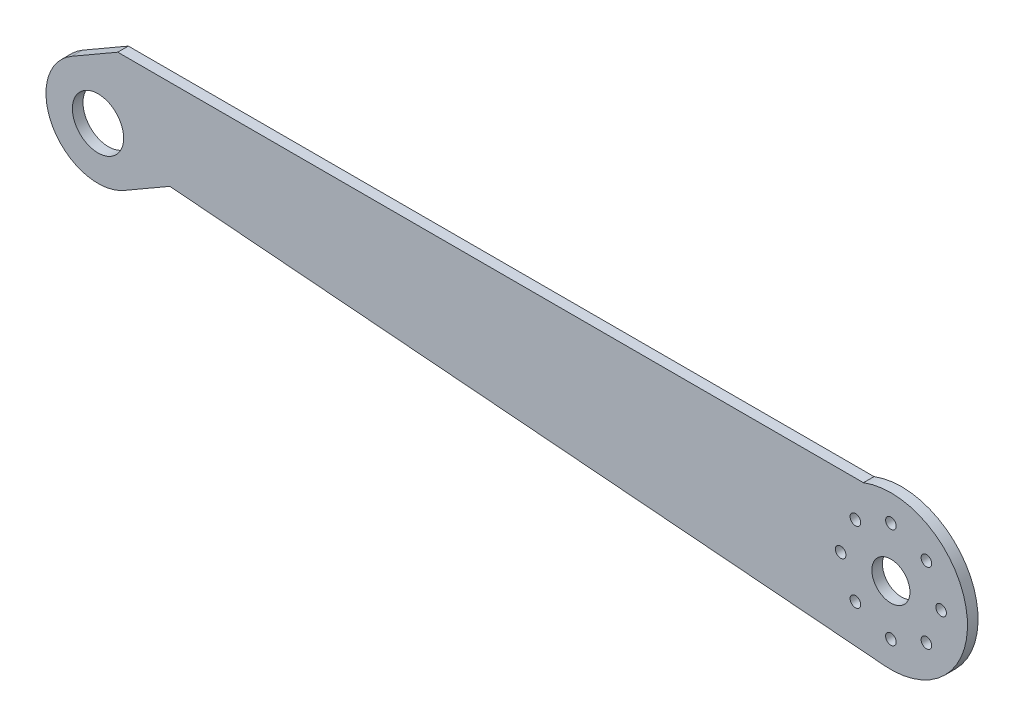
ISO-10303-21;
HEADER;
FILE_DESCRIPTION(('STEP AP214'),'2;1');
FILE_NAME('part.step','',(''),(''),'','','');
FILE_SCHEMA(('AUTOMOTIVE_DESIGN { 1 0 10303 214 1 1 1 1 }'));
ENDSEC;
DATA;
#1=APPLICATION_CONTEXT('core data for automotive mechanical design processes');
#2=APPLICATION_PROTOCOL_DEFINITION('international standard','automotive_design',2000,#1);
#3=PRODUCT_CONTEXT('',#1,'mechanical');
#4=PRODUCT('Part','Part','',(#3));
#5=PRODUCT_RELATED_PRODUCT_CATEGORY('part','',(#4));
#6=PRODUCT_DEFINITION_FORMATION('','',#4);
#7=PRODUCT_DEFINITION_CONTEXT('part definition',#1,'design');
#8=PRODUCT_DEFINITION('design','',#6,#7);
#9=PRODUCT_DEFINITION_SHAPE('','',#8);
#10=(LENGTH_UNIT() NAMED_UNIT(*) SI_UNIT(.MILLI.,.METRE.));
#11=(NAMED_UNIT(*) PLANE_ANGLE_UNIT() SI_UNIT($,.RADIAN.));
#12=(NAMED_UNIT(*) SI_UNIT($,.STERADIAN.) SOLID_ANGLE_UNIT());
#13=UNCERTAINTY_MEASURE_WITH_UNIT(LENGTH_MEASURE(1.E-05),#10,'distance_accuracy_value','');
#14=(GEOMETRIC_REPRESENTATION_CONTEXT(3) GLOBAL_UNCERTAINTY_ASSIGNED_CONTEXT((#13)) GLOBAL_UNIT_ASSIGNED_CONTEXT((#10,
#11,#12)) REPRESENTATION_CONTEXT('',''));
#15=CARTESIAN_POINT('',(0.,0.,0.));
#16=DIRECTION('',(0.,0.,1.));
#17=DIRECTION('',(1.,0.,0.));
#18=AXIS2_PLACEMENT_3D('',#15,#16,#17);
#19=CARTESIAN_POINT('',(0.,0.,4.));
#20=DIRECTION('',(0.,0.,-1.));
#21=DIRECTION('',(-1.,0.,0.));
#22=AXIS2_PLACEMENT_3D('',#19,#20,#21);
#23=PLANE('',#22);
#24=CARTESIAN_POINT('',(0.,0.,4.));
#25=DIRECTION('',(0.,0.,1.));
#26=DIRECTION('',(-1.,0.,0.));
#27=AXIS2_PLACEMENT_3D('',#24,#25,#26);
#28=CIRCLE('',#27,19.7);
#29=CARTESIAN_POINT('',(-9.85000000000009,17.0607004545534,4.));
#30=VERTEX_POINT('',#29);
#31=CARTESIAN_POINT('',(9.85000000000009,-17.0607004545534,4.));
#32=VERTEX_POINT('',#31);
#33=EDGE_CURVE('E132',#30,#32,#28,.T.);
#34=ORIENTED_EDGE('',*,*,#33,.T.);
#35=DIRECTION('',(0.866025403784436,0.500000000000004,0.));
#36=VECTOR('',#35,1.);
#37=CARTESIAN_POINT('',(9.85000000000009,-17.0607004545534,4.));
#38=LINE('',#37,#36);
#39=CARTESIAN_POINT('',(27.1705080756888,-7.06070045455331,4.));
#40=VERTEX_POINT('',#39);
#41=EDGE_CURVE('E90',#32,#40,#38,.T.);
#42=ORIENTED_EDGE('',*,*,#41,.T.);
#43=DIRECTION('',(0.996754774778399,-0.0804979438027058,0.));
#44=VECTOR('',#43,1.);
#45=CARTESIAN_POINT('',(27.1705080756888,-7.06070045455331,4.));
#46=LINE('',#45,#44);
#47=CARTESIAN_POINT('',(297.665559629722,-28.9058884685736,4.));
#48=VERTEX_POINT('',#47);
#49=EDGE_CURVE('E103',#40,#48,#46,.T.);
#50=ORIENTED_EDGE('',*,*,#49,.T.);
#51=CARTESIAN_POINT('',(299.999218229697,-0.00968016381513675,4.));
#52=DIRECTION('',(0.,0.,1.));
#53=DIRECTION('',(-1.,0.,0.));
#54=AXIS2_PLACEMENT_3D('',#51,#52,#53);
#55=CIRCLE('',#54,28.9902883195947);
#56=CARTESIAN_POINT('',(289.624667153632,27.0607004545535,4.));
#57=VERTEX_POINT('',#56);
#58=EDGE_CURVE('E97',#48,#57,#55,.T.);
#59=ORIENTED_EDGE('',*,*,#58,.T.);
#60=DIRECTION('',(-1.,0.,0.));
#61=VECTOR('',#60,1.);
#62=CARTESIAN_POINT('',(289.624667153632,27.0607004545535,4.));
#63=LINE('',#62,#61);
#64=CARTESIAN_POINT('',(7.47050807568864,27.0607004545535,4.));
#65=VERTEX_POINT('',#64);
#66=EDGE_CURVE('E101',#57,#65,#63,.T.);
#67=ORIENTED_EDGE('',*,*,#66,.T.);
#68=DIRECTION('',(-0.866025403784436,-0.500000000000004,0.));
#69=VECTOR('',#68,1.);
#70=CARTESIAN_POINT('',(-9.85000000000009,17.0607004545534,4.));
#71=LINE('',#70,#69);
#72=EDGE_CURVE('E53',#65,#30,#71,.T.);
#73=ORIENTED_EDGE('',*,*,#72,.T.);
#74=EDGE_LOOP('',(#34,#42,#50,#59,#67,#73));
#75=FACE_BOUND('',#74,.T.);
#76=CARTESIAN_POINT('',(0.,0.,4.));
#77=DIRECTION('',(0.,0.,1.));
#78=DIRECTION('',(1.,0.,0.));
#79=AXIS2_PLACEMENT_3D('',#76,#77,#78);
#80=CIRCLE('',#79,9.7);
#81=CARTESIAN_POINT('',(9.7,0.,4.));
#82=VERTEX_POINT('',#81);
#83=EDGE_CURVE('E125',#82,#82,#80,.T.);
#84=ORIENTED_EDGE('',*,*,#83,.F.);
#85=EDGE_LOOP('',(#84));
#86=FACE_BOUND('',#85,.T.);
#87=CARTESIAN_POINT('',(300.,0.,4.));
#88=DIRECTION('',(0.,0.,1.));
#89=DIRECTION('',(1.,0.,0.));
#90=AXIS2_PLACEMENT_3D('',#87,#88,#89);
#91=CIRCLE('',#90,7.19999999999997);
#92=CARTESIAN_POINT('',(307.2,0.,4.));
#93=VERTEX_POINT('',#92);
#94=EDGE_CURVE('E256',#93,#93,#91,.T.);
#95=ORIENTED_EDGE('',*,*,#94,.F.);
#96=EDGE_LOOP('',(#95));
#97=FACE_BOUND('',#96,.T.);
#98=CARTESIAN_POINT('',(319.,0.,4.));
#99=DIRECTION('',(0.,0.,1.));
#100=DIRECTION('',(1.,0.,0.));
#101=AXIS2_PLACEMENT_3D('',#98,#99,#100);
#102=CIRCLE('',#101,2.);
#103=CARTESIAN_POINT('',(321.,0.,4.));
#104=VERTEX_POINT('',#103);
#105=EDGE_CURVE('E250',#104,#104,#102,.T.);
#106=ORIENTED_EDGE('',*,*,#105,.F.);
#107=EDGE_LOOP('',(#106));
#108=FACE_BOUND('',#107,.T.);
#109=CARTESIAN_POINT('',(313.435028842544,-13.4350288425444,4.));
#110=DIRECTION('',(0.,0.,1.));
#111=DIRECTION('',(1.,0.,0.));
#112=AXIS2_PLACEMENT_3D('',#109,#110,#111);
#113=CIRCLE('',#112,1.99999999999999);
#114=CARTESIAN_POINT('',(315.435028842544,-13.4350288425444,4.));
#115=VERTEX_POINT('',#114);
#116=EDGE_CURVE('E244',#115,#115,#113,.T.);
#117=ORIENTED_EDGE('',*,*,#116,.F.);
#118=EDGE_LOOP('',(#117));
#119=FACE_BOUND('',#118,.T.);
#120=CARTESIAN_POINT('',(300.,-19.,4.));
#121=DIRECTION('',(0.,0.,1.));
#122=DIRECTION('',(1.,0.,0.));
#123=AXIS2_PLACEMENT_3D('',#120,#121,#122);
#124=CIRCLE('',#123,2.);
#125=CARTESIAN_POINT('',(302.,-19.,4.));
#126=VERTEX_POINT('',#125);
#127=EDGE_CURVE('E238',#126,#126,#124,.T.);
#128=ORIENTED_EDGE('',*,*,#127,.F.);
#129=EDGE_LOOP('',(#128));
#130=FACE_BOUND('',#129,.T.);
#131=CARTESIAN_POINT('',(286.564971157456,-13.4350288425444,4.));
#132=DIRECTION('',(0.,0.,1.));
#133=DIRECTION('',(1.,0.,0.));
#134=AXIS2_PLACEMENT_3D('',#131,#132,#133);
#135=CIRCLE('',#134,2.);
#136=CARTESIAN_POINT('',(288.564971157456,-13.4350288425444,4.));
#137=VERTEX_POINT('',#136);
#138=EDGE_CURVE('E232',#137,#137,#135,.T.);
#139=ORIENTED_EDGE('',*,*,#138,.F.);
#140=EDGE_LOOP('',(#139));
#141=FACE_BOUND('',#140,.T.);
#142=CARTESIAN_POINT('',(281.,0.,4.));
#143=DIRECTION('',(0.,0.,1.));
#144=DIRECTION('',(1.,0.,0.));
#145=AXIS2_PLACEMENT_3D('',#142,#143,#144);
#146=CIRCLE('',#145,2.);
#147=CARTESIAN_POINT('',(283.,0.,4.));
#148=VERTEX_POINT('',#147);
#149=EDGE_CURVE('E226',#148,#148,#146,.T.);
#150=ORIENTED_EDGE('',*,*,#149,.F.);
#151=EDGE_LOOP('',(#150));
#152=FACE_BOUND('',#151,.T.);
#153=CARTESIAN_POINT('',(286.564971157456,13.4350288425444,4.));
#154=DIRECTION('',(0.,0.,1.));
#155=DIRECTION('',(1.,0.,0.));
#156=AXIS2_PLACEMENT_3D('',#153,#154,#155);
#157=CIRCLE('',#156,1.99999999999999);
#158=CARTESIAN_POINT('',(288.564971157456,13.4350288425444,4.));
#159=VERTEX_POINT('',#158);
#160=EDGE_CURVE('E220',#159,#159,#157,.T.);
#161=ORIENTED_EDGE('',*,*,#160,.F.);
#162=EDGE_LOOP('',(#161));
#163=FACE_BOUND('',#162,.T.);
#164=CARTESIAN_POINT('',(300.,19.,4.));
#165=DIRECTION('',(0.,0.,1.));
#166=DIRECTION('',(1.,0.,0.));
#167=AXIS2_PLACEMENT_3D('',#164,#165,#166);
#168=CIRCLE('',#167,2.);
#169=CARTESIAN_POINT('',(302.,19.,4.));
#170=VERTEX_POINT('',#169);
#171=EDGE_CURVE('E214',#170,#170,#168,.T.);
#172=ORIENTED_EDGE('',*,*,#171,.F.);
#173=EDGE_LOOP('',(#172));
#174=FACE_BOUND('',#173,.T.);
#175=CARTESIAN_POINT('',(313.435028842544,13.4350288425444,4.));
#176=DIRECTION('',(0.,0.,1.));
#177=DIRECTION('',(1.,0.,0.));
#178=AXIS2_PLACEMENT_3D('',#175,#176,#177);
#179=CIRCLE('',#178,2.);
#180=CARTESIAN_POINT('',(315.435028842544,13.4350288425444,4.));
#181=VERTEX_POINT('',#180);
#182=EDGE_CURVE('E205',#181,#181,#179,.T.);
#183=ORIENTED_EDGE('',*,*,#182,.F.);
#184=EDGE_LOOP('',(#183));
#185=FACE_BOUND('',#184,.T.);
#186=ADVANCED_FACE('F36',(#75,#86,#97,#108,#119,#130,#141,#152,#163,#174,#185),#23,.F.);
#187=CARTESIAN_POINT('',(0.,0.,0.));
#188=DIRECTION('',(0.,0.,-1.));
#189=DIRECTION('',(-1.,0.,0.));
#190=AXIS2_PLACEMENT_3D('',#187,#188,#189);
#191=PLANE('',#190);
#192=CARTESIAN_POINT('',(300.,19.,0.));
#193=DIRECTION('',(0.,0.,1.));
#194=DIRECTION('',(1.,0.,0.));
#195=AXIS2_PLACEMENT_3D('',#192,#193,#194);
#196=CIRCLE('',#195,2.);
#197=CARTESIAN_POINT('',(302.,19.,0.));
#198=VERTEX_POINT('',#197);
#199=EDGE_CURVE('E211',#198,#198,#196,.T.);
#200=ORIENTED_EDGE('',*,*,#199,.T.);
#201=EDGE_LOOP('',(#200));
#202=FACE_BOUND('',#201,.T.);
#203=CARTESIAN_POINT('',(281.,0.,0.));
#204=DIRECTION('',(0.,0.,1.));
#205=DIRECTION('',(1.,0.,0.));
#206=AXIS2_PLACEMENT_3D('',#203,#204,#205);
#207=CIRCLE('',#206,2.);
#208=CARTESIAN_POINT('',(283.,0.,0.));
#209=VERTEX_POINT('',#208);
#210=EDGE_CURVE('E223',#209,#209,#207,.T.);
#211=ORIENTED_EDGE('',*,*,#210,.T.);
#212=EDGE_LOOP('',(#211));
#213=FACE_BOUND('',#212,.T.);
#214=CARTESIAN_POINT('',(300.,-19.,0.));
#215=DIRECTION('',(0.,0.,1.));
#216=DIRECTION('',(1.,0.,0.));
#217=AXIS2_PLACEMENT_3D('',#214,#215,#216);
#218=CIRCLE('',#217,2.);
#219=CARTESIAN_POINT('',(302.,-19.,0.));
#220=VERTEX_POINT('',#219);
#221=EDGE_CURVE('E235',#220,#220,#218,.T.);
#222=ORIENTED_EDGE('',*,*,#221,.T.);
#223=EDGE_LOOP('',(#222));
#224=FACE_BOUND('',#223,.T.);
#225=CARTESIAN_POINT('',(319.,0.,0.));
#226=DIRECTION('',(0.,0.,1.));
#227=DIRECTION('',(1.,0.,0.));
#228=AXIS2_PLACEMENT_3D('',#225,#226,#227);
#229=CIRCLE('',#228,2.);
#230=CARTESIAN_POINT('',(321.,0.,0.));
#231=VERTEX_POINT('',#230);
#232=EDGE_CURVE('E247',#231,#231,#229,.T.);
#233=ORIENTED_EDGE('',*,*,#232,.T.);
#234=EDGE_LOOP('',(#233));
#235=FACE_BOUND('',#234,.T.);
#236=CARTESIAN_POINT('',(0.,0.,0.));
#237=DIRECTION('',(0.,0.,1.));
#238=DIRECTION('',(1.,0.,0.));
#239=AXIS2_PLACEMENT_3D('',#236,#237,#238);
#240=CIRCLE('',#239,9.7);
#241=CARTESIAN_POINT('',(9.7,0.,0.));
#242=VERTEX_POINT('',#241);
#243=EDGE_CURVE('E259',#242,#242,#240,.T.);
#244=ORIENTED_EDGE('',*,*,#243,.T.);
#245=EDGE_LOOP('',(#244));
#246=FACE_BOUND('',#245,.T.);
#247=CARTESIAN_POINT('',(0.,0.,0.));
#248=DIRECTION('',(0.,0.,1.));
#249=DIRECTION('',(-1.,0.,0.));
#250=AXIS2_PLACEMENT_3D('',#247,#248,#249);
#251=CIRCLE('',#250,19.7);
#252=CARTESIAN_POINT('',(-9.85000000000009,17.0607004545534,0.));
#253=VERTEX_POINT('',#252);
#254=CARTESIAN_POINT('',(9.85000000000009,-17.0607004545534,0.));
#255=VERTEX_POINT('',#254);
#256=EDGE_CURVE('E121',#253,#255,#251,.T.);
#257=ORIENTED_EDGE('',*,*,#256,.F.);
#258=DIRECTION('',(-0.866025403784436,-0.500000000000004,0.));
#259=VECTOR('',#258,1.);
#260=CARTESIAN_POINT('',(-9.85000000000009,17.0607004545534,0.));
#261=LINE('',#260,#259);
#262=CARTESIAN_POINT('',(7.47050807568864,27.0607004545535,0.));
#263=VERTEX_POINT('',#262);
#264=EDGE_CURVE('E82',#263,#253,#261,.T.);
#265=ORIENTED_EDGE('',*,*,#264,.F.);
#266=DIRECTION('',(-1.,0.,0.));
#267=VECTOR('',#266,1.);
#268=CARTESIAN_POINT('',(289.624667153632,27.0607004545535,0.));
#269=LINE('',#268,#267);
#270=CARTESIAN_POINT('',(289.624667153632,27.0607004545535,0.));
#271=VERTEX_POINT('',#270);
#272=EDGE_CURVE('E76',#271,#263,#269,.T.);
#273=ORIENTED_EDGE('',*,*,#272,.F.);
#274=CARTESIAN_POINT('',(299.999218229697,-0.00968016381513675,0.));
#275=DIRECTION('',(0.,0.,1.));
#276=DIRECTION('',(-1.,0.,0.));
#277=AXIS2_PLACEMENT_3D('',#274,#275,#276);
#278=CIRCLE('',#277,28.9902883195947);
#279=CARTESIAN_POINT('',(297.665559629722,-28.9058884685736,0.));
#280=VERTEX_POINT('',#279);
#281=EDGE_CURVE('E111',#280,#271,#278,.T.);
#282=ORIENTED_EDGE('',*,*,#281,.F.);
#283=DIRECTION('',(0.996754774778399,-0.0804979438027058,0.));
#284=VECTOR('',#283,1.);
#285=CARTESIAN_POINT('',(27.1705080756888,-7.06070045455331,0.));
#286=LINE('',#285,#284);
#287=CARTESIAN_POINT('',(27.1705080756888,-7.06070045455331,0.));
#288=VERTEX_POINT('',#287);
#289=EDGE_CURVE('E127',#288,#280,#286,.T.);
#290=ORIENTED_EDGE('',*,*,#289,.F.);
#291=DIRECTION('',(0.866025403784436,0.500000000000004,0.));
#292=VECTOR('',#291,1.);
#293=CARTESIAN_POINT('',(9.85000000000009,-17.0607004545534,0.));
#294=LINE('',#293,#292);
#295=EDGE_CURVE('E124',#255,#288,#294,.T.);
#296=ORIENTED_EDGE('',*,*,#295,.F.);
#297=EDGE_LOOP('',(#257,#265,#273,#282,#290,#296));
#298=FACE_BOUND('',#297,.T.);
#299=CARTESIAN_POINT('',(300.,0.,0.));
#300=DIRECTION('',(0.,0.,1.));
#301=DIRECTION('',(1.,0.,0.));
#302=AXIS2_PLACEMENT_3D('',#299,#300,#301);
#303=CIRCLE('',#302,7.19999999999997);
#304=CARTESIAN_POINT('',(307.2,0.,0.));
#305=VERTEX_POINT('',#304);
#306=EDGE_CURVE('E253',#305,#305,#303,.T.);
#307=ORIENTED_EDGE('',*,*,#306,.T.);
#308=EDGE_LOOP('',(#307));
#309=FACE_BOUND('',#308,.T.);
#310=CARTESIAN_POINT('',(313.435028842544,-13.4350288425444,0.));
#311=DIRECTION('',(0.,0.,1.));
#312=DIRECTION('',(1.,0.,0.));
#313=AXIS2_PLACEMENT_3D('',#310,#311,#312);
#314=CIRCLE('',#313,1.99999999999999);
#315=CARTESIAN_POINT('',(315.435028842544,-13.4350288425444,0.));
#316=VERTEX_POINT('',#315);
#317=EDGE_CURVE('E241',#316,#316,#314,.T.);
#318=ORIENTED_EDGE('',*,*,#317,.T.);
#319=EDGE_LOOP('',(#318));
#320=FACE_BOUND('',#319,.T.);
#321=CARTESIAN_POINT('',(286.564971157456,-13.4350288425444,0.));
#322=DIRECTION('',(0.,0.,1.));
#323=DIRECTION('',(1.,0.,0.));
#324=AXIS2_PLACEMENT_3D('',#321,#322,#323);
#325=CIRCLE('',#324,2.);
#326=CARTESIAN_POINT('',(288.564971157456,-13.4350288425444,0.));
#327=VERTEX_POINT('',#326);
#328=EDGE_CURVE('E229',#327,#327,#325,.T.);
#329=ORIENTED_EDGE('',*,*,#328,.T.);
#330=EDGE_LOOP('',(#329));
#331=FACE_BOUND('',#330,.T.);
#332=CARTESIAN_POINT('',(286.564971157456,13.4350288425444,0.));
#333=DIRECTION('',(0.,0.,1.));
#334=DIRECTION('',(1.,0.,0.));
#335=AXIS2_PLACEMENT_3D('',#332,#333,#334);
#336=CIRCLE('',#335,1.99999999999999);
#337=CARTESIAN_POINT('',(288.564971157456,13.4350288425444,0.));
#338=VERTEX_POINT('',#337);
#339=EDGE_CURVE('E217',#338,#338,#336,.T.);
#340=ORIENTED_EDGE('',*,*,#339,.T.);
#341=EDGE_LOOP('',(#340));
#342=FACE_BOUND('',#341,.T.);
#343=CARTESIAN_POINT('',(313.435028842544,13.4350288425444,0.));
#344=DIRECTION('',(0.,0.,1.));
#345=DIRECTION('',(1.,0.,0.));
#346=AXIS2_PLACEMENT_3D('',#343,#344,#345);
#347=CIRCLE('',#346,2.);
#348=CARTESIAN_POINT('',(315.435028842544,13.4350288425444,0.));
#349=VERTEX_POINT('',#348);
#350=EDGE_CURVE('E208',#349,#349,#347,.T.);
#351=ORIENTED_EDGE('',*,*,#350,.T.);
#352=EDGE_LOOP('',(#351));
#353=FACE_BOUND('',#352,.T.);
#354=ADVANCED_FACE('F141',(#202,#213,#224,#235,#246,#298,#309,#320,#331,#342,#353),#191,.T.);
#355=CARTESIAN_POINT('',(0.,0.,4.));
#356=DIRECTION('',(0.,0.,-1.));
#357=DIRECTION('',(-1.,0.,0.));
#358=AXIS2_PLACEMENT_3D('',#355,#356,#357);
#359=CYLINDRICAL_SURFACE('',#358,19.7);
#360=ORIENTED_EDGE('',*,*,#256,.T.);
#361=DIRECTION('',(0.,0.,-1.));
#362=VECTOR('',#361,1.);
#363=CARTESIAN_POINT('',(9.85000000000009,-17.0607004545534,4.));
#364=LINE('',#363,#362);
#365=EDGE_CURVE('E11',#32,#255,#364,.T.);
#366=ORIENTED_EDGE('',*,*,#365,.F.);
#367=ORIENTED_EDGE('',*,*,#33,.F.);
#368=DIRECTION('',(0.,0.,-1.));
#369=VECTOR('',#368,1.);
#370=CARTESIAN_POINT('',(-9.85000000000009,17.0607004545534,4.));
#371=LINE('',#370,#369);
#372=EDGE_CURVE('E117',#30,#253,#371,.T.);
#373=ORIENTED_EDGE('',*,*,#372,.T.);
#374=EDGE_LOOP('',(#360,#366,#367,#373));
#375=FACE_BOUND('',#374,.T.);
#376=ADVANCED_FACE('F38',(#375),#359,.T.);
#377=CARTESIAN_POINT('',(9.85000000000009,-17.0607004545534,4.));
#378=DIRECTION('',(-0.500000000000004,0.866025403784436,0.));
#379=DIRECTION('',(-0.866025403784436,-0.500000000000004,0.));
#380=AXIS2_PLACEMENT_3D('',#377,#378,#379);
#381=PLANE('',#380);
#382=ORIENTED_EDGE('',*,*,#295,.T.);
#383=DIRECTION('',(0.,0.,-1.));
#384=VECTOR('',#383,1.);
#385=CARTESIAN_POINT('',(27.1705080756888,-7.06070045455331,4.));
#386=LINE('',#385,#384);
#387=EDGE_CURVE('E45',#40,#288,#386,.T.);
#388=ORIENTED_EDGE('',*,*,#387,.F.);
#389=ORIENTED_EDGE('',*,*,#41,.F.);
#390=ORIENTED_EDGE('',*,*,#365,.T.);
#391=EDGE_LOOP('',(#382,#388,#389,#390));
#392=FACE_BOUND('',#391,.T.);
#393=ADVANCED_FACE('F373',(#392),#381,.F.);
#394=CARTESIAN_POINT('',(27.1705080756888,-7.06070045455331,4.));
#395=DIRECTION('',(0.0804979438027058,0.996754774778399,0.));
#396=DIRECTION('',(-0.996754774778399,0.0804979438027058,0.));
#397=AXIS2_PLACEMENT_3D('',#394,#395,#396);
#398=PLANE('',#397);
#399=ORIENTED_EDGE('',*,*,#289,.T.);
#400=DIRECTION('',(0.,0.,-1.));
#401=VECTOR('',#400,1.);
#402=CARTESIAN_POINT('',(297.665559629722,-28.9058884685736,4.));
#403=LINE('',#402,#401);
#404=EDGE_CURVE('E112',#48,#280,#403,.T.);
#405=ORIENTED_EDGE('',*,*,#404,.F.);
#406=ORIENTED_EDGE('',*,*,#49,.F.);
#407=ORIENTED_EDGE('',*,*,#387,.T.);
#408=EDGE_LOOP('',(#399,#405,#406,#407));
#409=FACE_BOUND('',#408,.T.);
#410=ADVANCED_FACE('F138',(#409),#398,.F.);
#411=CARTESIAN_POINT('',(299.999218229697,-0.00968016381513675,4.));
#412=DIRECTION('',(0.,0.,-1.));
#413=DIRECTION('',(-1.,0.,0.));
#414=AXIS2_PLACEMENT_3D('',#411,#412,#413);
#415=CYLINDRICAL_SURFACE('',#414,28.9902883195947);
#416=ORIENTED_EDGE('',*,*,#281,.T.);
#417=DIRECTION('',(0.,0.,-1.));
#418=VECTOR('',#417,1.);
#419=CARTESIAN_POINT('',(289.624667153632,27.0607004545535,4.));
#420=LINE('',#419,#418);
#421=EDGE_CURVE('E108',#57,#271,#420,.T.);
#422=ORIENTED_EDGE('',*,*,#421,.F.);
#423=ORIENTED_EDGE('',*,*,#58,.F.);
#424=ORIENTED_EDGE('',*,*,#404,.T.);
#425=EDGE_LOOP('',(#416,#422,#423,#424));
#426=FACE_BOUND('',#425,.T.);
#427=ADVANCED_FACE('F109',(#426),#415,.T.);
#428=CARTESIAN_POINT('',(289.624667153632,27.0607004545535,4.));
#429=DIRECTION('',(0.,-1.,0.));
#430=DIRECTION('',(1.,0.,0.));
#431=AXIS2_PLACEMENT_3D('',#428,#429,#430);
#432=PLANE('',#431);
#433=ORIENTED_EDGE('',*,*,#272,.T.);
#434=DIRECTION('',(0.,0.,-1.));
#435=VECTOR('',#434,1.);
#436=CARTESIAN_POINT('',(7.47050807568864,27.0607004545535,4.));
#437=LINE('',#436,#435);
#438=EDGE_CURVE('E113',#65,#263,#437,.T.);
#439=ORIENTED_EDGE('',*,*,#438,.F.);
#440=ORIENTED_EDGE('',*,*,#66,.F.);
#441=ORIENTED_EDGE('',*,*,#421,.T.);
#442=EDGE_LOOP('',(#433,#439,#440,#441));
#443=FACE_BOUND('',#442,.T.);
#444=ADVANCED_FACE('F115',(#443),#432,.F.);
#445=CARTESIAN_POINT('',(-9.85000000000009,17.0607004545534,4.));
#446=DIRECTION('',(0.500000000000004,-0.866025403784436,0.));
#447=DIRECTION('',(0.866025403784436,0.500000000000004,0.));
#448=AXIS2_PLACEMENT_3D('',#445,#446,#447);
#449=PLANE('',#448);
#450=ORIENTED_EDGE('',*,*,#264,.T.);
#451=ORIENTED_EDGE('',*,*,#372,.F.);
#452=ORIENTED_EDGE('',*,*,#72,.F.);
#453=ORIENTED_EDGE('',*,*,#438,.T.);
#454=EDGE_LOOP('',(#450,#451,#452,#453));
#455=FACE_BOUND('',#454,.T.);
#456=ADVANCED_FACE('F146',(#455),#449,.F.);
#457=CARTESIAN_POINT('',(0.,0.,4.));
#458=DIRECTION('',(0.,0.,-1.));
#459=DIRECTION('',(-1.,0.,0.));
#460=AXIS2_PLACEMENT_3D('',#457,#458,#459);
#461=CYLINDRICAL_SURFACE('',#460,9.7);
#462=ORIENTED_EDGE('',*,*,#83,.T.);
#463=EDGE_LOOP('',(#462));
#464=FACE_BOUND('',#463,.T.);
#465=ORIENTED_EDGE('',*,*,#243,.F.);
#466=EDGE_LOOP('',(#465));
#467=FACE_BOUND('',#466,.T.);
#468=ADVANCED_FACE('F148',(#464,#467),#461,.F.);
#469=CARTESIAN_POINT('',(300.,0.,4.));
#470=DIRECTION('',(0.,0.,-1.));
#471=DIRECTION('',(-1.,0.,0.));
#472=AXIS2_PLACEMENT_3D('',#469,#470,#471);
#473=CYLINDRICAL_SURFACE('',#472,7.19999999999997);
#474=ORIENTED_EDGE('',*,*,#94,.T.);
#475=EDGE_LOOP('',(#474));
#476=FACE_BOUND('',#475,.T.);
#477=ORIENTED_EDGE('',*,*,#306,.F.);
#478=EDGE_LOOP('',(#477));
#479=FACE_BOUND('',#478,.T.);
#480=ADVANCED_FACE('F154',(#476,#479),#473,.F.);
#481=CARTESIAN_POINT('',(319.,0.,4.));
#482=DIRECTION('',(0.,0.,-1.));
#483=DIRECTION('',(-1.,0.,0.));
#484=AXIS2_PLACEMENT_3D('',#481,#482,#483);
#485=CYLINDRICAL_SURFACE('',#484,2.);
#486=ORIENTED_EDGE('',*,*,#105,.T.);
#487=EDGE_LOOP('',(#486));
#488=FACE_BOUND('',#487,.T.);
#489=ORIENTED_EDGE('',*,*,#232,.F.);
#490=EDGE_LOOP('',(#489));
#491=FACE_BOUND('',#490,.T.);
#492=ADVANCED_FACE('F168',(#488,#491),#485,.F.);
#493=CARTESIAN_POINT('',(313.435028842544,-13.4350288425444,4.));
#494=DIRECTION('',(0.,0.,-1.));
#495=DIRECTION('',(-1.,0.,0.));
#496=AXIS2_PLACEMENT_3D('',#493,#494,#495);
#497=CYLINDRICAL_SURFACE('',#496,1.99999999999999);
#498=ORIENTED_EDGE('',*,*,#116,.T.);
#499=EDGE_LOOP('',(#498));
#500=FACE_BOUND('',#499,.T.);
#501=ORIENTED_EDGE('',*,*,#317,.F.);
#502=EDGE_LOOP('',(#501));
#503=FACE_BOUND('',#502,.T.);
#504=ADVANCED_FACE('F172',(#500,#503),#497,.F.);
#505=CARTESIAN_POINT('',(300.,-19.,4.));
#506=DIRECTION('',(0.,0.,-1.));
#507=DIRECTION('',(-1.,0.,0.));
#508=AXIS2_PLACEMENT_3D('',#505,#506,#507);
#509=CYLINDRICAL_SURFACE('',#508,2.);
#510=ORIENTED_EDGE('',*,*,#127,.T.);
#511=EDGE_LOOP('',(#510));
#512=FACE_BOUND('',#511,.T.);
#513=ORIENTED_EDGE('',*,*,#221,.F.);
#514=EDGE_LOOP('',(#513));
#515=FACE_BOUND('',#514,.T.);
#516=ADVANCED_FACE('F176',(#512,#515),#509,.F.);
#517=CARTESIAN_POINT('',(286.564971157456,-13.4350288425444,4.));
#518=DIRECTION('',(0.,0.,-1.));
#519=DIRECTION('',(-1.,0.,0.));
#520=AXIS2_PLACEMENT_3D('',#517,#518,#519);
#521=CYLINDRICAL_SURFACE('',#520,2.);
#522=ORIENTED_EDGE('',*,*,#138,.T.);
#523=EDGE_LOOP('',(#522));
#524=FACE_BOUND('',#523,.T.);
#525=ORIENTED_EDGE('',*,*,#328,.F.);
#526=EDGE_LOOP('',(#525));
#527=FACE_BOUND('',#526,.T.);
#528=ADVANCED_FACE('F180',(#524,#527),#521,.F.);
#529=CARTESIAN_POINT('',(281.,0.,4.));
#530=DIRECTION('',(0.,0.,-1.));
#531=DIRECTION('',(-1.,0.,0.));
#532=AXIS2_PLACEMENT_3D('',#529,#530,#531);
#533=CYLINDRICAL_SURFACE('',#532,2.);
#534=ORIENTED_EDGE('',*,*,#149,.T.);
#535=EDGE_LOOP('',(#534));
#536=FACE_BOUND('',#535,.T.);
#537=ORIENTED_EDGE('',*,*,#210,.F.);
#538=EDGE_LOOP('',(#537));
#539=FACE_BOUND('',#538,.T.);
#540=ADVANCED_FACE('F184',(#536,#539),#533,.F.);
#541=CARTESIAN_POINT('',(286.564971157456,13.4350288425444,4.));
#542=DIRECTION('',(0.,0.,-1.));
#543=DIRECTION('',(-1.,0.,0.));
#544=AXIS2_PLACEMENT_3D('',#541,#542,#543);
#545=CYLINDRICAL_SURFACE('',#544,1.99999999999999);
#546=ORIENTED_EDGE('',*,*,#160,.T.);
#547=EDGE_LOOP('',(#546));
#548=FACE_BOUND('',#547,.T.);
#549=ORIENTED_EDGE('',*,*,#339,.F.);
#550=EDGE_LOOP('',(#549));
#551=FACE_BOUND('',#550,.T.);
#552=ADVANCED_FACE('F188',(#548,#551),#545,.F.);
#553=CARTESIAN_POINT('',(300.,19.,4.));
#554=DIRECTION('',(0.,0.,-1.));
#555=DIRECTION('',(-1.,0.,0.));
#556=AXIS2_PLACEMENT_3D('',#553,#554,#555);
#557=CYLINDRICAL_SURFACE('',#556,2.);
#558=ORIENTED_EDGE('',*,*,#171,.T.);
#559=EDGE_LOOP('',(#558));
#560=FACE_BOUND('',#559,.T.);
#561=ORIENTED_EDGE('',*,*,#199,.F.);
#562=EDGE_LOOP('',(#561));
#563=FACE_BOUND('',#562,.T.);
#564=ADVANCED_FACE('F192',(#560,#563),#557,.F.);
#565=CARTESIAN_POINT('',(313.435028842544,13.4350288425444,4.));
#566=DIRECTION('',(0.,0.,-1.));
#567=DIRECTION('',(-1.,0.,0.));
#568=AXIS2_PLACEMENT_3D('',#565,#566,#567);
#569=CYLINDRICAL_SURFACE('',#568,2.);
#570=ORIENTED_EDGE('',*,*,#182,.T.);
#571=EDGE_LOOP('',(#570));
#572=FACE_BOUND('',#571,.T.);
#573=ORIENTED_EDGE('',*,*,#350,.F.);
#574=EDGE_LOOP('',(#573));
#575=FACE_BOUND('',#574,.T.);
#576=ADVANCED_FACE('F196',(#572,#575),#569,.F.);
#577=CLOSED_SHELL('',(#186,#354,#376,#393,#410,#427,#444,#456,#468,#480,#492,#504,#516,#528,
#540,#552,#564,#576));
#578=MANIFOLD_SOLID_BREP('B2',#577);
#579=ADVANCED_BREP_SHAPE_REPRESENTATION('',(#18,#578),#14);
#580=SHAPE_DEFINITION_REPRESENTATION(#9,#579);
ENDSEC;
END-ISO-10303-21;
